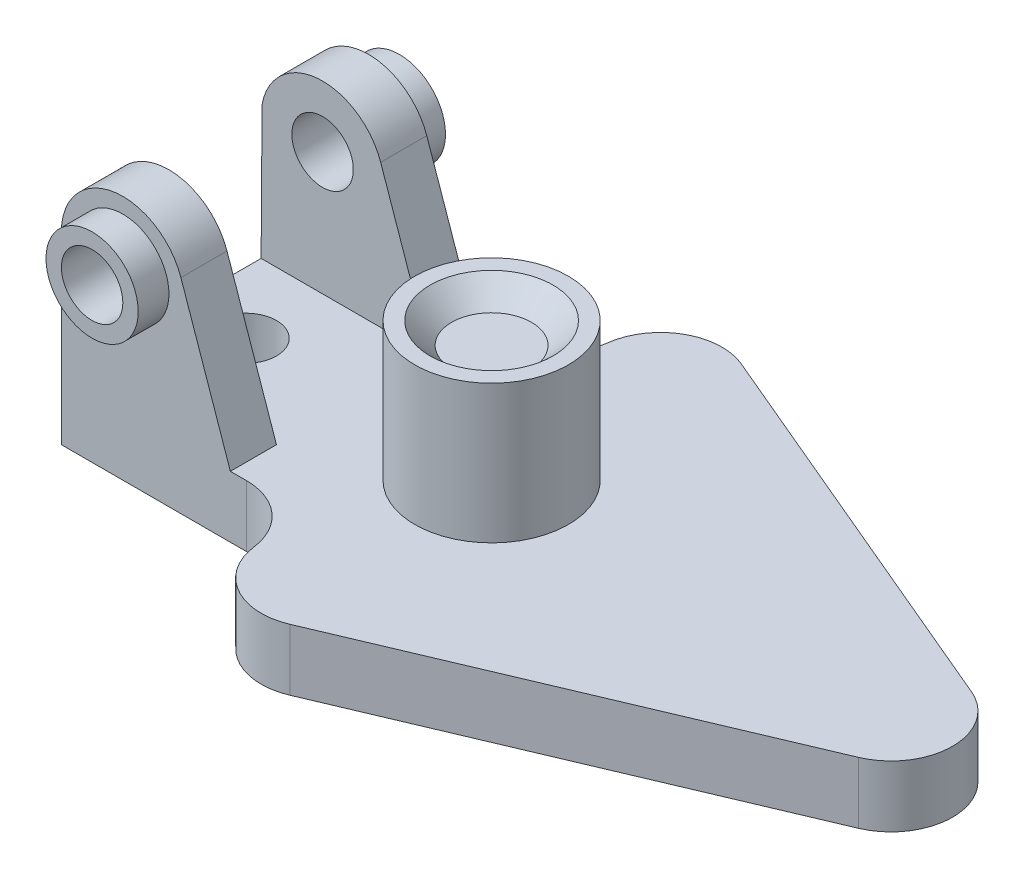
ISO-10303-21;
HEADER;
FILE_DESCRIPTION(('STEP AP214'),'2;1');
FILE_NAME('part.step','',(''),(''),'','','');
FILE_SCHEMA(('AUTOMOTIVE_DESIGN { 1 0 10303 214 1 1 1 1 }'));
ENDSEC;
DATA;
#1=APPLICATION_CONTEXT('core data for automotive mechanical design processes');
#2=APPLICATION_PROTOCOL_DEFINITION('international standard','automotive_design',2000,#1);
#3=PRODUCT_CONTEXT('',#1,'mechanical');
#4=PRODUCT('Part','Part','',(#3));
#5=PRODUCT_RELATED_PRODUCT_CATEGORY('part','',(#4));
#6=PRODUCT_DEFINITION_FORMATION('','',#4);
#7=PRODUCT_DEFINITION_CONTEXT('part definition',#1,'design');
#8=PRODUCT_DEFINITION('design','',#6,#7);
#9=PRODUCT_DEFINITION_SHAPE('','',#8);
#10=(LENGTH_UNIT() NAMED_UNIT(*) SI_UNIT(.MILLI.,.METRE.));
#11=(NAMED_UNIT(*) PLANE_ANGLE_UNIT() SI_UNIT($,.RADIAN.));
#12=(NAMED_UNIT(*) SI_UNIT($,.STERADIAN.) SOLID_ANGLE_UNIT());
#13=UNCERTAINTY_MEASURE_WITH_UNIT(LENGTH_MEASURE(1.E-05),#10,'distance_accuracy_value','');
#14=(GEOMETRIC_REPRESENTATION_CONTEXT(3) GLOBAL_UNCERTAINTY_ASSIGNED_CONTEXT((#13)) GLOBAL_UNIT_ASSIGNED_CONTEXT((#10,
#11,#12)) REPRESENTATION_CONTEXT('',''));
#15=CARTESIAN_POINT('',(0.,0.,0.));
#16=DIRECTION('',(0.,0.,1.));
#17=DIRECTION('',(1.,0.,0.));
#18=AXIS2_PLACEMENT_3D('',#15,#16,#17);
#19=CARTESIAN_POINT('',(-77.2801181104764,20.,56.6735980217483));
#20=DIRECTION('',(0.,0.,-1.));
#21=DIRECTION('',(-1.,0.,0.));
#22=AXIS2_PLACEMENT_3D('',#19,#20,#21);
#23=PLANE('',#22);
#24=DIRECTION('',(1.,0.,0.));
#25=VECTOR('',#24,1.);
#26=CARTESIAN_POINT('',(-77.2801181104764,0.,56.6735980217483));
#27=LINE('',#26,#25);
#28=CARTESIAN_POINT('',(-77.2801181104764,0.,56.6735980217483));
#29=VERTEX_POINT('',#28);
#30=CARTESIAN_POINT('',(-16.9663877764453,0.,56.6735980217482));
#31=VERTEX_POINT('',#30);
#32=EDGE_CURVE('E314',#29,#31,#27,.T.);
#33=ORIENTED_EDGE('',*,*,#32,.T.);
#34=DIRECTION('',(0.,-1.,0.));
#35=VECTOR('',#34,1.);
#36=CARTESIAN_POINT('',(-16.9663877764453,20.,56.6735980217482));
#37=LINE('',#36,#35);
#38=CARTESIAN_POINT('',(-16.9663877764453,20.,56.6735980217482));
#39=VERTEX_POINT('',#38);
#40=EDGE_CURVE('E364',#39,#31,#37,.T.);
#41=ORIENTED_EDGE('',*,*,#40,.F.);
#42=DIRECTION('',(1.,0.,0.));
#43=VECTOR('',#42,1.);
#44=CARTESIAN_POINT('',(-77.2801181104764,20.,56.6735980217483));
#45=LINE('',#44,#43);
#46=CARTESIAN_POINT('',(-22.2801181104764,20.,56.6735980217482));
#47=VERTEX_POINT('',#46);
#48=EDGE_CURVE('E196',#47,#39,#45,.T.);
#49=ORIENTED_EDGE('',*,*,#48,.F.);
#50=DIRECTION('',(-0.326920394801529,0.945051879773175,0.));
#51=VECTOR('',#50,1.);
#52=CARTESIAN_POINT('',(-38.3790805150129,66.5384078960306,56.6735980217482));
#53=LINE('',#52,#51);
#54=CARTESIAN_POINT('',(-38.3790805150129,66.5384078960306,56.6735980217482));
#55=VERTEX_POINT('',#54);
#56=EDGE_CURVE('E240',#47,#55,#53,.T.);
#57=ORIENTED_EDGE('',*,*,#56,.T.);
#58=CARTESIAN_POINT('',(-57.2801181104764,60.,56.6735980217482));
#59=DIRECTION('',(0.,0.,1.));
#60=DIRECTION('',(-1.,0.,0.));
#61=AXIS2_PLACEMENT_3D('',#58,#59,#60);
#62=CIRCLE('',#61,20.);
#63=CARTESIAN_POINT('',(-77.2801181104764,60.,56.6735980217482));
#64=VERTEX_POINT('',#63);
#65=EDGE_CURVE('E245',#55,#64,#62,.T.);
#66=ORIENTED_EDGE('',*,*,#65,.T.);
#67=DIRECTION('',(0.,-1.,0.));
#68=VECTOR('',#67,1.);
#69=CARTESIAN_POINT('',(-77.2801181104764,20.,56.6735980217483));
#70=LINE('',#69,#68);
#71=EDGE_CURVE('E368',#64,#29,#70,.T.);
#72=ORIENTED_EDGE('',*,*,#71,.T.);
#73=EDGE_LOOP('',(#33,#41,#49,#57,#66,#72));
#74=FACE_BOUND('',#73,.T.);
#75=CARTESIAN_POINT('',(-57.2801181104764,60.,56.6735980217483));
#76=DIRECTION('',(0.,0.,-1.));
#77=DIRECTION('',(-1.,0.,0.));
#78=AXIS2_PLACEMENT_3D('',#75,#76,#77);
#79=CIRCLE('',#78,15.);
#80=CARTESIAN_POINT('',(-72.2801181104764,60.,56.6735980217483));
#81=VERTEX_POINT('',#80);
#82=EDGE_CURVE('E60',#81,#81,#79,.F.);
#83=ORIENTED_EDGE('',*,*,#82,.F.);
#84=EDGE_LOOP('',(#83));
#85=FACE_BOUND('',#84,.T.);
#86=ADVANCED_FACE('F51',(#74,#85),#23,.F.);
#87=CARTESIAN_POINT('',(-16.9663877764453,20.,-43.3264019782518));
#88=DIRECTION('',(0.,1.,0.));
#89=DIRECTION('',(0.,0.,1.));
#90=AXIS2_PLACEMENT_3D('',#87,#88,#89);
#91=PLANE('',#90);
#92=CARTESIAN_POINT('',(22.7198818895236,20.,16.6735980217483));
#93=DIRECTION('',(0.,1.,0.));
#94=DIRECTION('',(0.,0.,1.));
#95=AXIS2_PLACEMENT_3D('',#92,#93,#94);
#96=CIRCLE('',#95,25.);
#97=CARTESIAN_POINT('',(22.7198818895236,20.,-8.32640197825173));
#98=VERTEX_POINT('',#97);
#99=EDGE_CURVE('E782',#98,#98,#96,.T.);
#100=ORIENTED_EDGE('',*,*,#99,.F.);
#101=EDGE_LOOP('',(#100));
#102=FACE_BOUND('',#101,.T.);
#103=DIRECTION('',(0.,0.,-1.));
#104=VECTOR('',#103,1.);
#105=CARTESIAN_POINT('',(-22.2801181104764,20.,-8.32640197825174));
#106=LINE('',#105,#104);
#107=CARTESIAN_POINT('',(-22.2801181104764,20.,-8.32640197825175));
#108=VERTEX_POINT('',#107);
#109=CARTESIAN_POINT('',(-22.2801181104764,20.,-23.3264019782517));
#110=VERTEX_POINT('',#109);
#111=EDGE_CURVE('E67',#108,#110,#106,.T.);
#112=ORIENTED_EDGE('',*,*,#111,.F.);
#113=DIRECTION('',(-1.,0.,0.));
#114=VECTOR('',#113,1.);
#115=CARTESIAN_POINT('',(-77.2801181104764,20.,-8.32640197825175));
#116=LINE('',#115,#114);
#117=CARTESIAN_POINT('',(-77.2801181104764,20.,-8.32640197825175));
#118=VERTEX_POINT('',#117);
#119=EDGE_CURVE('E178',#108,#118,#116,.T.);
#120=ORIENTED_EDGE('',*,*,#119,.T.);
#121=DIRECTION('',(0.,0.,1.));
#122=VECTOR('',#121,1.);
#123=CARTESIAN_POINT('',(-77.2801181104764,20.,56.6735980217483));
#124=LINE('',#123,#122);
#125=CARTESIAN_POINT('',(-77.2801181104764,20.,41.6735980217482));
#126=VERTEX_POINT('',#125);
#127=EDGE_CURVE('E166',#118,#126,#124,.T.);
#128=ORIENTED_EDGE('',*,*,#127,.T.);
#129=DIRECTION('',(1.,0.,0.));
#130=VECTOR('',#129,1.);
#131=CARTESIAN_POINT('',(-77.2801181104764,20.,41.6735980217482));
#132=LINE('',#131,#130);
#133=CARTESIAN_POINT('',(-22.2801181104764,20.,41.6735980217482));
#134=VERTEX_POINT('',#133);
#135=EDGE_CURVE('E241',#126,#134,#132,.T.);
#136=ORIENTED_EDGE('',*,*,#135,.T.);
#137=DIRECTION('',(0.,0.,1.));
#138=VECTOR('',#137,1.);
#139=CARTESIAN_POINT('',(-22.2801181104764,20.,41.6735980217482));
#140=LINE('',#139,#138);
#141=EDGE_CURVE('E255',#134,#47,#140,.T.);
#142=ORIENTED_EDGE('',*,*,#141,.T.);
#143=ORIENTED_EDGE('',*,*,#48,.T.);
#144=CARTESIAN_POINT('',(-16.9663877764453,20.,76.6735980217483));
#145=DIRECTION('',(0.,-1.,0.));
#146=DIRECTION('',(0.,0.,-1.));
#147=AXIS2_PLACEMENT_3D('',#144,#145,#146);
#148=CIRCLE('',#147,20.);
#149=CARTESIAN_POINT('',(2.87674705653915,20.,74.1735980217483));
#150=VERTEX_POINT('',#149);
#151=EDGE_CURVE('E286',#39,#150,#148,.T.);
#152=ORIENTED_EDGE('',*,*,#151,.T.);
#153=CARTESIAN_POINT('',(22.7198818895236,20.,71.6735980217482));
#154=DIRECTION('',(0.,1.,0.));
#155=DIRECTION('',(0.,0.,1.));
#156=AXIS2_PLACEMENT_3D('',#153,#154,#155);
#157=CIRCLE('',#156,20.);
#158=CARTESIAN_POINT('',(30.5126817062575,20.,90.0929430431194));
#159=VERTEX_POINT('',#158);
#160=EDGE_CURVE('E289',#150,#159,#157,.T.);
#161=ORIENTED_EDGE('',*,*,#160,.T.);
#162=DIRECTION('',(0.920967251068559,0.,-0.389639990836698));
#163=VECTOR('',#162,1.);
#164=CARTESIAN_POINT('',(30.5126817062575,20.,90.0929430431194));
#165=LINE('',#164,#163);
#166=CARTESIAN_POINT('',(160.512681706258,20.,35.0929430431194));
#167=VERTEX_POINT('',#166);
#168=EDGE_CURVE('E292',#159,#167,#165,.T.);
#169=ORIENTED_EDGE('',*,*,#168,.T.);
#170=CARTESIAN_POINT('',(152.719881889524,20.,16.6735980217483));
#171=DIRECTION('',(0.,1.,0.));
#172=DIRECTION('',(0.,0.,1.));
#173=AXIS2_PLACEMENT_3D('',#170,#171,#172);
#174=CIRCLE('',#173,20.);
#175=CARTESIAN_POINT('',(160.512681706258,20.,-1.74574699962293));
#176=VERTEX_POINT('',#175);
#177=EDGE_CURVE('E295',#167,#176,#174,.T.);
#178=ORIENTED_EDGE('',*,*,#177,.T.);
#179=DIRECTION('',(-0.920967251068559,0.,-0.389639990836698));
#180=VECTOR('',#179,1.);
#181=CARTESIAN_POINT('',(30.5126817062575,20.,-56.7457469996229));
#182=LINE('',#181,#180);
#183=CARTESIAN_POINT('',(30.5126817062575,20.,-56.7457469996229));
#184=VERTEX_POINT('',#183);
#185=EDGE_CURVE('E298',#176,#184,#182,.T.);
#186=ORIENTED_EDGE('',*,*,#185,.T.);
#187=CARTESIAN_POINT('',(22.7198818895236,20.,-38.3264019782517));
#188=DIRECTION('',(0.,1.,0.));
#189=DIRECTION('',(0.,0.,-1.));
#190=AXIS2_PLACEMENT_3D('',#187,#188,#189);
#191=CIRCLE('',#190,20.);
#192=CARTESIAN_POINT('',(2.87674705653914,20.,-40.8264019782518));
#193=VERTEX_POINT('',#192);
#194=EDGE_CURVE('E301',#184,#193,#191,.T.);
#195=ORIENTED_EDGE('',*,*,#194,.T.);
#196=CARTESIAN_POINT('',(-16.9663877764453,20.,-43.3264019782518));
#197=DIRECTION('',(0.,-1.,0.));
#198=DIRECTION('',(0.,0.,1.));
#199=AXIS2_PLACEMENT_3D('',#196,#197,#198);
#200=CIRCLE('',#199,20.);
#201=CARTESIAN_POINT('',(-16.9663877764453,20.,-23.3264019782518));
#202=VERTEX_POINT('',#201);
#203=EDGE_CURVE('E304',#193,#202,#200,.T.);
#204=ORIENTED_EDGE('',*,*,#203,.T.);
#205=DIRECTION('',(-1.,0.,0.));
#206=VECTOR('',#205,1.);
#207=CARTESIAN_POINT('',(-77.2801181104764,20.,-23.3264019782517));
#208=LINE('',#207,#206);
#209=EDGE_CURVE('E72',#202,#110,#208,.T.);
#210=ORIENTED_EDGE('',*,*,#209,.T.);
#211=EDGE_LOOP('',(#112,#120,#128,#136,#142,#143,#152,#161,#169,#178,#186,#195,#204,#210));
#212=FACE_BOUND('',#211,.T.);
#213=CARTESIAN_POINT('',(-57.2801181104764,20.,16.6735980217483));
#214=DIRECTION('',(0.,1.,0.));
#215=DIRECTION('',(0.,0.,1.));
#216=AXIS2_PLACEMENT_3D('',#213,#214,#215);
#217=CIRCLE('',#216,10.);
#218=CARTESIAN_POINT('',(-57.2801181104764,20.,26.6735980217483));
#219=VERTEX_POINT('',#218);
#220=EDGE_CURVE('E273',#219,#219,#217,.T.);
#221=ORIENTED_EDGE('',*,*,#220,.F.);
#222=EDGE_LOOP('',(#221));
#223=FACE_BOUND('',#222,.T.);
#224=ADVANCED_FACE('F179',(#102,#212,#223),#91,.T.);
#225=CARTESIAN_POINT('',(-16.9663877764453,0.,-43.3264019782518));
#226=DIRECTION('',(0.,1.,0.));
#227=DIRECTION('',(0.,0.,1.));
#228=AXIS2_PLACEMENT_3D('',#225,#226,#227);
#229=PLANE('',#228);
#230=DIRECTION('',(-1.,0.,0.));
#231=VECTOR('',#230,1.);
#232=CARTESIAN_POINT('',(-77.2801181104764,0.,-23.3264019782517));
#233=LINE('',#232,#231);
#234=CARTESIAN_POINT('',(-16.9663877764453,0.,-23.3264019782518));
#235=VERTEX_POINT('',#234);
#236=CARTESIAN_POINT('',(-77.2801181104764,0.,-23.3264019782517));
#237=VERTEX_POINT('',#236);
#238=EDGE_CURVE('E277',#235,#237,#233,.T.);
#239=ORIENTED_EDGE('',*,*,#238,.F.);
#240=CARTESIAN_POINT('',(-16.9663877764453,0.,-43.3264019782518));
#241=DIRECTION('',(0.,-1.,0.));
#242=DIRECTION('',(0.,0.,1.));
#243=AXIS2_PLACEMENT_3D('',#240,#241,#242);
#244=CIRCLE('',#243,20.);
#245=CARTESIAN_POINT('',(2.87674705653914,0.,-40.8264019782518));
#246=VERTEX_POINT('',#245);
#247=EDGE_CURVE('E282',#246,#235,#244,.T.);
#248=ORIENTED_EDGE('',*,*,#247,.F.);
#249=CARTESIAN_POINT('',(22.7198818895236,0.,-38.3264019782517));
#250=DIRECTION('',(0.,1.,0.));
#251=DIRECTION('',(0.,0.,-1.));
#252=AXIS2_PLACEMENT_3D('',#249,#250,#251);
#253=CIRCLE('',#252,20.);
#254=CARTESIAN_POINT('',(30.5126817062575,0.,-56.7457469996229));
#255=VERTEX_POINT('',#254);
#256=EDGE_CURVE('E332',#255,#246,#253,.T.);
#257=ORIENTED_EDGE('',*,*,#256,.F.);
#258=DIRECTION('',(-0.920967251068559,0.,-0.389639990836698));
#259=VECTOR('',#258,1.);
#260=CARTESIAN_POINT('',(30.5126817062575,0.,-56.7457469996229));
#261=LINE('',#260,#259);
#262=CARTESIAN_POINT('',(160.512681706258,0.,-1.74574699962293));
#263=VERTEX_POINT('',#262);
#264=EDGE_CURVE('E329',#263,#255,#261,.T.);
#265=ORIENTED_EDGE('',*,*,#264,.F.);
#266=CARTESIAN_POINT('',(152.719881889524,0.,16.6735980217483));
#267=DIRECTION('',(0.,1.,0.));
#268=DIRECTION('',(0.,0.,1.));
#269=AXIS2_PLACEMENT_3D('',#266,#267,#268);
#270=CIRCLE('',#269,20.);
#271=CARTESIAN_POINT('',(160.512681706258,0.,35.0929430431194));
#272=VERTEX_POINT('',#271);
#273=EDGE_CURVE('E326',#272,#263,#270,.T.);
#274=ORIENTED_EDGE('',*,*,#273,.F.);
#275=DIRECTION('',(0.920967251068559,0.,-0.389639990836698));
#276=VECTOR('',#275,1.);
#277=CARTESIAN_POINT('',(30.5126817062575,0.,90.0929430431194));
#278=LINE('',#277,#276);
#279=CARTESIAN_POINT('',(30.5126817062575,0.,90.0929430431194));
#280=VERTEX_POINT('',#279);
#281=EDGE_CURVE('E323',#280,#272,#278,.T.);
#282=ORIENTED_EDGE('',*,*,#281,.F.);
#283=CARTESIAN_POINT('',(22.7198818895236,0.,71.6735980217482));
#284=DIRECTION('',(0.,1.,0.));
#285=DIRECTION('',(0.,0.,1.));
#286=AXIS2_PLACEMENT_3D('',#283,#284,#285);
#287=CIRCLE('',#286,20.);
#288=CARTESIAN_POINT('',(2.87674705653915,0.,74.1735980217483));
#289=VERTEX_POINT('',#288);
#290=EDGE_CURVE('E320',#289,#280,#287,.T.);
#291=ORIENTED_EDGE('',*,*,#290,.F.);
#292=CARTESIAN_POINT('',(-16.9663877764453,0.,76.6735980217483));
#293=DIRECTION('',(0.,-1.,0.));
#294=DIRECTION('',(0.,0.,-1.));
#295=AXIS2_PLACEMENT_3D('',#292,#293,#294);
#296=CIRCLE('',#295,20.);
#297=EDGE_CURVE('E317',#31,#289,#296,.T.);
#298=ORIENTED_EDGE('',*,*,#297,.F.);
#299=ORIENTED_EDGE('',*,*,#32,.F.);
#300=DIRECTION('',(0.,0.,1.));
#301=VECTOR('',#300,1.);
#302=CARTESIAN_POINT('',(-77.2801181104764,0.,56.6735980217483));
#303=LINE('',#302,#301);
#304=EDGE_CURVE('E311',#237,#29,#303,.T.);
#305=ORIENTED_EDGE('',*,*,#304,.F.);
#306=EDGE_LOOP('',(#239,#248,#257,#265,#274,#282,#291,#298,#299,#305));
#307=FACE_BOUND('',#306,.T.);
#308=CARTESIAN_POINT('',(-57.2801181104764,0.,16.6735980217483));
#309=DIRECTION('',(0.,1.,0.));
#310=DIRECTION('',(0.,0.,1.));
#311=AXIS2_PLACEMENT_3D('',#308,#309,#310);
#312=CIRCLE('',#311,10.);
#313=CARTESIAN_POINT('',(-57.2801181104764,0.,26.6735980217483));
#314=VERTEX_POINT('',#313);
#315=EDGE_CURVE('E266',#314,#314,#312,.T.);
#316=ORIENTED_EDGE('',*,*,#315,.T.);
#317=EDGE_LOOP('',(#316));
#318=FACE_BOUND('',#317,.T.);
#319=ADVANCED_FACE('F386',(#307,#318),#229,.F.);
#320=CARTESIAN_POINT('',(-77.2801181104764,20.,-23.3264019782517));
#321=DIRECTION('',(0.,0.,1.));
#322=DIRECTION('',(1.,0.,0.));
#323=AXIS2_PLACEMENT_3D('',#320,#321,#322);
#324=PLANE('',#323);
#325=CARTESIAN_POINT('',(-57.2801181104764,60.,-23.3264019782517));
#326=DIRECTION('',(0.,0.,1.));
#327=DIRECTION('',(1.,0.,0.));
#328=AXIS2_PLACEMENT_3D('',#325,#326,#327);
#329=CIRCLE('',#328,15.);
#330=CARTESIAN_POINT('',(-42.2801181104764,60.,-23.3264019782517));
#331=VERTEX_POINT('',#330);
#332=EDGE_CURVE('E12',#331,#331,#329,.F.);
#333=ORIENTED_EDGE('',*,*,#332,.F.);
#334=EDGE_LOOP('',(#333));
#335=FACE_BOUND('',#334,.T.);
#336=ORIENTED_EDGE('',*,*,#238,.T.);
#337=DIRECTION('',(0.,-1.,0.));
#338=VECTOR('',#337,1.);
#339=CARTESIAN_POINT('',(-77.2801181104764,20.,-23.3264019782517));
#340=LINE('',#339,#338);
#341=CARTESIAN_POINT('',(-77.2801181104764,20.,-23.3264019782517));
#342=VERTEX_POINT('',#341);
#343=EDGE_CURVE('E372',#342,#237,#340,.T.);
#344=ORIENTED_EDGE('',*,*,#343,.F.);
#345=DIRECTION('',(0.0071500071873193,0.999974438371912,0.));
#346=VECTOR('',#345,1.);
#347=CARTESIAN_POINT('',(-76.9689843899648,63.5140496052881,-23.3264019782517));
#348=LINE('',#347,#346);
#349=CARTESIAN_POINT('',(-76.9689843899648,63.5140496052881,-23.3264019782517));
#350=VERTEX_POINT('',#349);
#351=EDGE_CURVE('E194',#342,#350,#348,.T.);
#352=ORIENTED_EDGE('',*,*,#351,.T.);
#353=CARTESIAN_POINT('',(-57.2801181104764,60.,-23.3264019782517));
#354=DIRECTION('',(0.,0.,-1.));
#355=DIRECTION('',(1.,0.,0.));
#356=AXIS2_PLACEMENT_3D('',#353,#354,#355);
#357=CIRCLE('',#356,20.);
#358=CARTESIAN_POINT('',(-38.3790805150129,66.5384078960306,-23.3264019782517));
#359=VERTEX_POINT('',#358);
#360=EDGE_CURVE('E213',#350,#359,#357,.T.);
#361=ORIENTED_EDGE('',*,*,#360,.T.);
#362=DIRECTION('',(0.326920394801529,-0.945051879773175,0.));
#363=VECTOR('',#362,1.);
#364=CARTESIAN_POINT('',(-22.2801181104764,20.,-23.3264019782517));
#365=LINE('',#364,#363);
#366=EDGE_CURVE('E187',#359,#110,#365,.T.);
#367=ORIENTED_EDGE('',*,*,#366,.T.);
#368=ORIENTED_EDGE('',*,*,#209,.F.);
#369=DIRECTION('',(0.,-1.,0.));
#370=VECTOR('',#369,1.);
#371=CARTESIAN_POINT('',(-16.9663877764453,20.,-23.3264019782518));
#372=LINE('',#371,#370);
#373=EDGE_CURVE('E307',#202,#235,#372,.T.);
#374=ORIENTED_EDGE('',*,*,#373,.T.);
#375=EDGE_LOOP('',(#336,#344,#352,#361,#367,#368,#374));
#376=FACE_BOUND('',#375,.T.);
#377=ADVANCED_FACE('F53',(#335,#376),#324,.F.);
#378=CARTESIAN_POINT('',(-77.2801181104764,20.,56.6735980217483));
#379=DIRECTION('',(1.,0.,0.));
#380=DIRECTION('',(0.,0.,-1.));
#381=AXIS2_PLACEMENT_3D('',#378,#379,#380);
#382=PLANE('',#381);
#383=ORIENTED_EDGE('',*,*,#304,.T.);
#384=ORIENTED_EDGE('',*,*,#71,.F.);
#385=DIRECTION('',(0.,0.,1.));
#386=VECTOR('',#385,1.);
#387=CARTESIAN_POINT('',(-77.2801181104764,60.,41.6735980217482));
#388=LINE('',#387,#386);
#389=CARTESIAN_POINT('',(-77.2801181104764,60.,41.6735980217482));
#390=VERTEX_POINT('',#389);
#391=EDGE_CURVE('E262',#390,#64,#388,.T.);
#392=ORIENTED_EDGE('',*,*,#391,.F.);
#393=DIRECTION('',(0.,-1.,0.));
#394=VECTOR('',#393,1.);
#395=CARTESIAN_POINT('',(-77.2801181104764,20.,41.6735980217482));
#396=LINE('',#395,#394);
#397=EDGE_CURVE('E173',#390,#126,#396,.T.);
#398=ORIENTED_EDGE('',*,*,#397,.T.);
#399=ORIENTED_EDGE('',*,*,#127,.F.);
#400=EDGE_CURVE('E170',#342,#118,#124,.T.);
#401=ORIENTED_EDGE('',*,*,#400,.F.);
#402=ORIENTED_EDGE('',*,*,#343,.T.);
#403=EDGE_LOOP('',(#383,#384,#392,#398,#399,#401,#402));
#404=FACE_BOUND('',#403,.T.);
#405=ADVANCED_FACE('F167',(#404),#382,.F.);
#406=CARTESIAN_POINT('',(-16.9663877764453,20.,76.6735980217483));
#407=DIRECTION('',(0.,-1.,0.));
#408=DIRECTION('',(0.,0.,-1.));
#409=AXIS2_PLACEMENT_3D('',#406,#407,#408);
#410=CYLINDRICAL_SURFACE('',#409,20.);
#411=ORIENTED_EDGE('',*,*,#297,.T.);
#412=DIRECTION('',(0.,-1.,0.));
#413=VECTOR('',#412,1.);
#414=CARTESIAN_POINT('',(2.87674705653915,20.,74.1735980217483));
#415=LINE('',#414,#413);
#416=EDGE_CURVE('E360',#150,#289,#415,.T.);
#417=ORIENTED_EDGE('',*,*,#416,.F.);
#418=ORIENTED_EDGE('',*,*,#151,.F.);
#419=ORIENTED_EDGE('',*,*,#40,.T.);
#420=EDGE_LOOP('',(#411,#417,#418,#419));
#421=FACE_BOUND('',#420,.T.);
#422=ADVANCED_FACE('F390',(#421),#410,.F.);
#423=CARTESIAN_POINT('',(22.7198818895236,20.,71.6735980217482));
#424=DIRECTION('',(0.,-1.,0.));
#425=DIRECTION('',(0.,0.,-1.));
#426=AXIS2_PLACEMENT_3D('',#423,#424,#425);
#427=CYLINDRICAL_SURFACE('',#426,20.);
#428=ORIENTED_EDGE('',*,*,#290,.T.);
#429=DIRECTION('',(0.,-1.,0.));
#430=VECTOR('',#429,1.);
#431=CARTESIAN_POINT('',(30.5126817062575,20.,90.0929430431194));
#432=LINE('',#431,#430);
#433=EDGE_CURVE('E356',#159,#280,#432,.T.);
#434=ORIENTED_EDGE('',*,*,#433,.F.);
#435=ORIENTED_EDGE('',*,*,#160,.F.);
#436=ORIENTED_EDGE('',*,*,#416,.T.);
#437=EDGE_LOOP('',(#428,#434,#435,#436));
#438=FACE_BOUND('',#437,.T.);
#439=ADVANCED_FACE('F397',(#438),#427,.T.);
#440=CARTESIAN_POINT('',(30.5126817062575,20.,90.0929430431194));
#441=DIRECTION('',(-0.389639990836698,0.,-0.920967251068559));
#442=DIRECTION('',(-0.920967251068559,0.,0.389639990836698));
#443=AXIS2_PLACEMENT_3D('',#440,#441,#442);
#444=PLANE('',#443);
#445=ORIENTED_EDGE('',*,*,#281,.T.);
#446=DIRECTION('',(0.,-1.,0.));
#447=VECTOR('',#446,1.);
#448=CARTESIAN_POINT('',(160.512681706258,20.,35.0929430431194));
#449=LINE('',#448,#447);
#450=EDGE_CURVE('E352',#167,#272,#449,.T.);
#451=ORIENTED_EDGE('',*,*,#450,.F.);
#452=ORIENTED_EDGE('',*,*,#168,.F.);
#453=ORIENTED_EDGE('',*,*,#433,.T.);
#454=EDGE_LOOP('',(#445,#451,#452,#453));
#455=FACE_BOUND('',#454,.T.);
#456=ADVANCED_FACE('F434',(#455),#444,.F.);
#457=CARTESIAN_POINT('',(152.719881889524,20.,16.6735980217483));
#458=DIRECTION('',(0.,-1.,0.));
#459=DIRECTION('',(0.,0.,-1.));
#460=AXIS2_PLACEMENT_3D('',#457,#458,#459);
#461=CYLINDRICAL_SURFACE('',#460,20.);
#462=ORIENTED_EDGE('',*,*,#273,.T.);
#463=DIRECTION('',(0.,-1.,0.));
#464=VECTOR('',#463,1.);
#465=CARTESIAN_POINT('',(160.512681706258,20.,-1.74574699962293));
#466=LINE('',#465,#464);
#467=EDGE_CURVE('E348',#176,#263,#466,.T.);
#468=ORIENTED_EDGE('',*,*,#467,.F.);
#469=ORIENTED_EDGE('',*,*,#177,.F.);
#470=ORIENTED_EDGE('',*,*,#450,.T.);
#471=EDGE_LOOP('',(#462,#468,#469,#470));
#472=FACE_BOUND('',#471,.T.);
#473=ADVANCED_FACE('F439',(#472),#461,.T.);
#474=CARTESIAN_POINT('',(30.5126817062575,20.,-56.7457469996229));
#475=DIRECTION('',(-0.389639990836698,0.,0.920967251068559));
#476=DIRECTION('',(0.920967251068559,0.,0.389639990836698));
#477=AXIS2_PLACEMENT_3D('',#474,#475,#476);
#478=PLANE('',#477);
#479=ORIENTED_EDGE('',*,*,#264,.T.);
#480=DIRECTION('',(0.,-1.,0.));
#481=VECTOR('',#480,1.);
#482=CARTESIAN_POINT('',(30.5126817062575,20.,-56.7457469996229));
#483=LINE('',#482,#481);
#484=EDGE_CURVE('E344',#184,#255,#483,.T.);
#485=ORIENTED_EDGE('',*,*,#484,.F.);
#486=ORIENTED_EDGE('',*,*,#185,.F.);
#487=ORIENTED_EDGE('',*,*,#467,.T.);
#488=EDGE_LOOP('',(#479,#485,#486,#487));
#489=FACE_BOUND('',#488,.T.);
#490=ADVANCED_FACE('F445',(#489),#478,.F.);
#491=CARTESIAN_POINT('',(22.7198818895236,20.,-38.3264019782517));
#492=DIRECTION('',(0.,-1.,0.));
#493=DIRECTION('',(0.,0.,-1.));
#494=AXIS2_PLACEMENT_3D('',#491,#492,#493);
#495=CYLINDRICAL_SURFACE('',#494,20.);
#496=ORIENTED_EDGE('',*,*,#256,.T.);
#497=DIRECTION('',(0.,-1.,0.));
#498=VECTOR('',#497,1.);
#499=CARTESIAN_POINT('',(2.87674705653914,20.,-40.8264019782518));
#500=LINE('',#499,#498);
#501=EDGE_CURVE('E340',#193,#246,#500,.T.);
#502=ORIENTED_EDGE('',*,*,#501,.F.);
#503=ORIENTED_EDGE('',*,*,#194,.F.);
#504=ORIENTED_EDGE('',*,*,#484,.T.);
#505=EDGE_LOOP('',(#496,#502,#503,#504));
#506=FACE_BOUND('',#505,.T.);
#507=ADVANCED_FACE('F448',(#506),#495,.T.);
#508=CARTESIAN_POINT('',(-16.9663877764453,20.,-43.3264019782518));
#509=DIRECTION('',(0.,-1.,0.));
#510=DIRECTION('',(0.,0.,-1.));
#511=AXIS2_PLACEMENT_3D('',#508,#509,#510);
#512=CYLINDRICAL_SURFACE('',#511,20.);
#513=ORIENTED_EDGE('',*,*,#247,.T.);
#514=ORIENTED_EDGE('',*,*,#373,.F.);
#515=ORIENTED_EDGE('',*,*,#203,.F.);
#516=ORIENTED_EDGE('',*,*,#501,.T.);
#517=EDGE_LOOP('',(#513,#514,#515,#516));
#518=FACE_BOUND('',#517,.T.);
#519=ADVANCED_FACE('F451',(#518),#512,.F.);
#520=CARTESIAN_POINT('',(-57.2801181104764,20.,16.6735980217483));
#521=DIRECTION('',(0.,-1.,0.));
#522=DIRECTION('',(0.,0.,-1.));
#523=AXIS2_PLACEMENT_3D('',#520,#521,#522);
#524=CYLINDRICAL_SURFACE('',#523,10.);
#525=ORIENTED_EDGE('',*,*,#220,.T.);
#526=EDGE_LOOP('',(#525));
#527=FACE_BOUND('',#526,.T.);
#528=ORIENTED_EDGE('',*,*,#315,.F.);
#529=EDGE_LOOP('',(#528));
#530=FACE_BOUND('',#529,.T.);
#531=ADVANCED_FACE('F485',(#527,#530),#524,.F.);
#532=CARTESIAN_POINT('',(-57.2801181104764,60.,41.6735980217482));
#533=DIRECTION('',(0.,0.,1.));
#534=DIRECTION('',(1.,0.,0.));
#535=AXIS2_PLACEMENT_3D('',#532,#533,#534);
#536=CYLINDRICAL_SURFACE('',#535,20.);
#537=ORIENTED_EDGE('',*,*,#65,.F.);
#538=DIRECTION('',(0.,0.,1.));
#539=VECTOR('',#538,1.);
#540=CARTESIAN_POINT('',(-38.3790805150129,66.5384078960306,41.6735980217482));
#541=LINE('',#540,#539);
#542=CARTESIAN_POINT('',(-38.3790805150129,66.5384078960306,41.6735980217482));
#543=VERTEX_POINT('',#542);
#544=EDGE_CURVE('E267',#543,#55,#541,.T.);
#545=ORIENTED_EDGE('',*,*,#544,.F.);
#546=CARTESIAN_POINT('',(-57.2801181104764,60.,41.6735980217482));
#547=DIRECTION('',(0.,0.,1.));
#548=DIRECTION('',(-1.,0.,0.));
#549=AXIS2_PLACEMENT_3D('',#546,#547,#548);
#550=CIRCLE('',#549,20.);
#551=EDGE_CURVE('E249',#543,#390,#550,.T.);
#552=ORIENTED_EDGE('',*,*,#551,.T.);
#553=ORIENTED_EDGE('',*,*,#391,.T.);
#554=EDGE_LOOP('',(#537,#545,#552,#553));
#555=FACE_BOUND('',#554,.T.);
#556=ADVANCED_FACE('F418',(#555),#536,.T.);
#557=CARTESIAN_POINT('',(-38.3790805150129,66.5384078960306,41.6735980217482));
#558=DIRECTION('',(0.945051879773175,0.326920394801529,0.));
#559=DIRECTION('',(-0.326920394801529,0.945051879773176,0.));
#560=AXIS2_PLACEMENT_3D('',#557,#558,#559);
#561=PLANE('',#560);
#562=ORIENTED_EDGE('',*,*,#56,.F.);
#563=ORIENTED_EDGE('',*,*,#141,.F.);
#564=DIRECTION('',(-0.326920394801529,0.945051879773175,0.));
#565=VECTOR('',#564,1.);
#566=CARTESIAN_POINT('',(-38.3790805150129,66.5384078960306,41.6735980217482));
#567=LINE('',#566,#565);
#568=EDGE_CURVE('E244',#134,#543,#567,.T.);
#569=ORIENTED_EDGE('',*,*,#568,.T.);
#570=ORIENTED_EDGE('',*,*,#544,.T.);
#571=EDGE_LOOP('',(#562,#563,#569,#570));
#572=FACE_BOUND('',#571,.T.);
#573=ADVANCED_FACE('F481',(#572),#561,.T.);
#574=CARTESIAN_POINT('',(-57.2801181104764,60.,41.6735980217482));
#575=DIRECTION('',(0.,0.,-1.));
#576=DIRECTION('',(-1.,0.,0.));
#577=AXIS2_PLACEMENT_3D('',#574,#575,#576);
#578=PLANE('',#577);
#579=CARTESIAN_POINT('',(-57.2801181104764,60.,41.6735980217482));
#580=DIRECTION('',(0.,0.,1.));
#581=DIRECTION('',(1.,0.,0.));
#582=AXIS2_PLACEMENT_3D('',#579,#580,#581);
#583=CIRCLE('',#582,10.);
#584=CARTESIAN_POINT('',(-47.2801181104764,60.,41.6735980217482));
#585=VERTEX_POINT('',#584);
#586=EDGE_CURVE('E236',#585,#585,#583,.T.);
#587=ORIENTED_EDGE('',*,*,#586,.T.);
#588=EDGE_LOOP('',(#587));
#589=FACE_BOUND('',#588,.T.);
#590=ORIENTED_EDGE('',*,*,#135,.F.);
#591=ORIENTED_EDGE('',*,*,#397,.F.);
#592=ORIENTED_EDGE('',*,*,#551,.F.);
#593=ORIENTED_EDGE('',*,*,#568,.F.);
#594=EDGE_LOOP('',(#590,#591,#592,#593));
#595=FACE_BOUND('',#594,.T.);
#596=ADVANCED_FACE('F422',(#589,#595),#578,.T.);
#597=CARTESIAN_POINT('',(-57.2801181104764,60.,41.6735980217482));
#598=DIRECTION('',(0.,0.,1.));
#599=DIRECTION('',(1.,0.,0.));
#600=AXIS2_PLACEMENT_3D('',#597,#598,#599);
#601=CYLINDRICAL_SURFACE('',#600,10.);
#602=ORIENTED_EDGE('',*,*,#586,.F.);
#603=EDGE_LOOP('',(#602));
#604=FACE_BOUND('',#603,.T.);
#605=CARTESIAN_POINT('',(-57.2801181104764,60.,66.6735980217482));
#606=DIRECTION('',(0.,0.,1.));
#607=DIRECTION('',(1.,0.,0.));
#608=AXIS2_PLACEMENT_3D('',#605,#606,#607);
#609=CIRCLE('',#608,10.);
#610=CARTESIAN_POINT('',(-47.2801181104764,60.,66.6735980217482));
#611=VERTEX_POINT('',#610);
#612=EDGE_CURVE('E223',#611,#611,#609,.F.);
#613=ORIENTED_EDGE('',*,*,#612,.F.);
#614=EDGE_LOOP('',(#613));
#615=FACE_BOUND('',#614,.T.);
#616=ADVANCED_FACE('F474',(#604,#615),#601,.F.);
#617=CARTESIAN_POINT('',(-57.2801181104764,60.,66.6735980217482));
#618=DIRECTION('',(0.,0.,-1.));
#619=DIRECTION('',(-1.,0.,0.));
#620=AXIS2_PLACEMENT_3D('',#617,#618,#619);
#621=CYLINDRICAL_SURFACE('',#620,15.);
#622=CARTESIAN_POINT('',(-57.2801181104764,60.,66.6735980217482));
#623=DIRECTION('',(0.,0.,1.));
#624=DIRECTION('',(1.,0.,0.));
#625=AXIS2_PLACEMENT_3D('',#622,#623,#624);
#626=CIRCLE('',#625,15.);
#627=CARTESIAN_POINT('',(-42.2801181104764,60.,66.6735980217482));
#628=VERTEX_POINT('',#627);
#629=EDGE_CURVE('E232',#628,#628,#626,.T.);
#630=ORIENTED_EDGE('',*,*,#629,.F.);
#631=EDGE_LOOP('',(#630));
#632=FACE_BOUND('',#631,.T.);
#633=ORIENTED_EDGE('',*,*,#82,.T.);
#634=EDGE_LOOP('',(#633));
#635=FACE_BOUND('',#634,.T.);
#636=ADVANCED_FACE('F378',(#632,#635),#621,.T.);
#637=CARTESIAN_POINT('',(-57.2801181104764,60.,66.6735980217482));
#638=DIRECTION('',(0.,0.,1.));
#639=DIRECTION('',(1.,0.,0.));
#640=AXIS2_PLACEMENT_3D('',#637,#638,#639);
#641=PLANE('',#640);
#642=ORIENTED_EDGE('',*,*,#612,.T.);
#643=EDGE_LOOP('',(#642));
#644=FACE_BOUND('',#643,.T.);
#645=ORIENTED_EDGE('',*,*,#629,.T.);
#646=EDGE_LOOP('',(#645));
#647=FACE_BOUND('',#646,.T.);
#648=ADVANCED_FACE('F465',(#644,#647),#641,.T.);
#649=CARTESIAN_POINT('',(-22.2801181104764,20.,-8.32640197825174));
#650=DIRECTION('',(0.945051879773175,0.326920394801529,0.));
#651=DIRECTION('',(-0.326920394801529,0.945051879773176,0.));
#652=AXIS2_PLACEMENT_3D('',#649,#650,#651);
#653=PLANE('',#652);
#654=ORIENTED_EDGE('',*,*,#366,.F.);
#655=DIRECTION('',(0.,0.,-1.));
#656=VECTOR('',#655,1.);
#657=CARTESIAN_POINT('',(-38.3790805150129,66.5384078960306,-8.32640197825175));
#658=LINE('',#657,#656);
#659=CARTESIAN_POINT('',(-38.3790805150129,66.5384078960306,-8.32640197825175));
#660=VERTEX_POINT('',#659);
#661=EDGE_CURVE('E224',#660,#359,#658,.T.);
#662=ORIENTED_EDGE('',*,*,#661,.F.);
#663=DIRECTION('',(0.326920394801529,-0.945051879773175,0.));
#664=VECTOR('',#663,1.);
#665=CARTESIAN_POINT('',(-22.2801181104764,20.,-8.32640197825174));
#666=LINE('',#665,#664);
#667=EDGE_CURVE('E204',#660,#108,#666,.T.);
#668=ORIENTED_EDGE('',*,*,#667,.T.);
#669=ORIENTED_EDGE('',*,*,#111,.T.);
#670=EDGE_LOOP('',(#654,#662,#668,#669));
#671=FACE_BOUND('',#670,.T.);
#672=ADVANCED_FACE('F455',(#671),#653,.T.);
#673=CARTESIAN_POINT('',(-57.2801181104764,60.,-8.32640197825175));
#674=DIRECTION('',(0.,0.,-1.));
#675=DIRECTION('',(-1.,0.,0.));
#676=AXIS2_PLACEMENT_3D('',#673,#674,#675);
#677=CYLINDRICAL_SURFACE('',#676,20.);
#678=ORIENTED_EDGE('',*,*,#360,.F.);
#679=DIRECTION('',(0.,0.,-1.));
#680=VECTOR('',#679,1.);
#681=CARTESIAN_POINT('',(-76.9689843899648,63.5140496052881,-8.32640197825175));
#682=LINE('',#681,#680);
#683=CARTESIAN_POINT('',(-76.9689843899648,63.5140496052881,-8.32640197825175));
#684=VERTEX_POINT('',#683);
#685=EDGE_CURVE('E210',#684,#350,#682,.T.);
#686=ORIENTED_EDGE('',*,*,#685,.F.);
#687=CARTESIAN_POINT('',(-57.2801181104764,60.,-8.32640197825175));
#688=DIRECTION('',(0.,0.,-1.));
#689=DIRECTION('',(1.,0.,0.));
#690=AXIS2_PLACEMENT_3D('',#687,#688,#689);
#691=CIRCLE('',#690,20.);
#692=EDGE_CURVE('E200',#684,#660,#691,.T.);
#693=ORIENTED_EDGE('',*,*,#692,.T.);
#694=ORIENTED_EDGE('',*,*,#661,.T.);
#695=EDGE_LOOP('',(#678,#686,#693,#694));
#696=FACE_BOUND('',#695,.T.);
#697=ADVANCED_FACE('F457',(#696),#677,.T.);
#698=CARTESIAN_POINT('',(-76.9689843899648,63.5140496052881,-8.32640197825175));
#699=DIRECTION('',(-0.999974438371912,0.0071500071873193,0.));
#700=DIRECTION('',(-0.0071500071873193,-0.999974438371912,0.));
#701=AXIS2_PLACEMENT_3D('',#698,#699,#700);
#702=PLANE('',#701);
#703=ORIENTED_EDGE('',*,*,#351,.F.);
#704=ORIENTED_EDGE('',*,*,#400,.T.);
#705=DIRECTION('',(0.0071500071873193,0.999974438371912,0.));
#706=VECTOR('',#705,1.);
#707=CARTESIAN_POINT('',(-76.9689843899648,63.5140496052881,-8.32640197825175));
#708=LINE('',#707,#706);
#709=EDGE_CURVE('E186',#118,#684,#708,.T.);
#710=ORIENTED_EDGE('',*,*,#709,.T.);
#711=ORIENTED_EDGE('',*,*,#685,.T.);
#712=EDGE_LOOP('',(#703,#704,#710,#711));
#713=FACE_BOUND('',#712,.T.);
#714=ADVANCED_FACE('F192',(#713),#702,.T.);
#715=CARTESIAN_POINT('',(-57.2801181104764,60.,-8.32640197825175));
#716=DIRECTION('',(0.,0.,1.));
#717=DIRECTION('',(1.,0.,0.));
#718=AXIS2_PLACEMENT_3D('',#715,#716,#717);
#719=PLANE('',#718);
#720=CARTESIAN_POINT('',(-57.2801181104764,60.,-8.32640197825175));
#721=DIRECTION('',(0.,0.,-1.));
#722=DIRECTION('',(-1.,0.,0.));
#723=AXIS2_PLACEMENT_3D('',#720,#721,#722);
#724=CIRCLE('',#723,9.99999999999999);
#725=CARTESIAN_POINT('',(-67.2801181104764,60.,-8.32640197825175));
#726=VERTEX_POINT('',#725);
#727=EDGE_CURVE('E214',#726,#726,#724,.T.);
#728=ORIENTED_EDGE('',*,*,#727,.T.);
#729=EDGE_LOOP('',(#728));
#730=FACE_BOUND('',#729,.T.);
#731=ORIENTED_EDGE('',*,*,#119,.F.);
#732=ORIENTED_EDGE('',*,*,#667,.F.);
#733=ORIENTED_EDGE('',*,*,#692,.F.);
#734=ORIENTED_EDGE('',*,*,#709,.F.);
#735=EDGE_LOOP('',(#731,#732,#733,#734));
#736=FACE_BOUND('',#735,.T.);
#737=ADVANCED_FACE('F198',(#730,#736),#719,.T.);
#738=CARTESIAN_POINT('',(-57.2801181104764,60.,-8.32640197825175));
#739=DIRECTION('',(0.,0.,-1.));
#740=DIRECTION('',(-1.,0.,0.));
#741=AXIS2_PLACEMENT_3D('',#738,#739,#740);
#742=CYLINDRICAL_SURFACE('',#741,9.99999999999999);
#743=ORIENTED_EDGE('',*,*,#727,.F.);
#744=EDGE_LOOP('',(#743));
#745=FACE_BOUND('',#744,.T.);
#746=CARTESIAN_POINT('',(-57.2801181104764,60.,-33.3264019782518));
#747=DIRECTION('',(0.,0.,-1.));
#748=DIRECTION('',(-1.,0.,0.));
#749=AXIS2_PLACEMENT_3D('',#746,#747,#748);
#750=CIRCLE('',#749,9.99999999999999);
#751=CARTESIAN_POINT('',(-67.2801181104764,60.,-33.3264019782518));
#752=VERTEX_POINT('',#751);
#753=EDGE_CURVE('E795',#752,#752,#750,.F.);
#754=ORIENTED_EDGE('',*,*,#753,.F.);
#755=EDGE_LOOP('',(#754));
#756=FACE_BOUND('',#755,.T.);
#757=ADVANCED_FACE('F581',(#745,#756),#742,.F.);
#758=CARTESIAN_POINT('',(-57.2801181104764,60.,-33.3264019782518));
#759=DIRECTION('',(0.,0.,1.));
#760=DIRECTION('',(1.,0.,0.));
#761=AXIS2_PLACEMENT_3D('',#758,#759,#760);
#762=CYLINDRICAL_SURFACE('',#761,15.);
#763=CARTESIAN_POINT('',(-57.2801181104764,60.,-33.3264019782518));
#764=DIRECTION('',(0.,0.,-1.));
#765=DIRECTION('',(-1.,0.,0.));
#766=AXIS2_PLACEMENT_3D('',#763,#764,#765);
#767=CIRCLE('',#766,15.);
#768=CARTESIAN_POINT('',(-72.2801181104764,60.,-33.3264019782518));
#769=VERTEX_POINT('',#768);
#770=EDGE_CURVE('E800',#769,#769,#767,.T.);
#771=ORIENTED_EDGE('',*,*,#770,.F.);
#772=EDGE_LOOP('',(#771));
#773=FACE_BOUND('',#772,.T.);
#774=ORIENTED_EDGE('',*,*,#332,.T.);
#775=EDGE_LOOP('',(#774));
#776=FACE_BOUND('',#775,.T.);
#777=ADVANCED_FACE('F597',(#773,#776),#762,.T.);
#778=CARTESIAN_POINT('',(0.,0.,-33.3264019782517));
#779=DIRECTION('',(0.,0.,-1.));
#780=DIRECTION('',(-1.,0.,0.));
#781=AXIS2_PLACEMENT_3D('',#778,#779,#780);
#782=PLANE('',#781);
#783=ORIENTED_EDGE('',*,*,#753,.T.);
#784=EDGE_LOOP('',(#783));
#785=FACE_BOUND('',#784,.T.);
#786=ORIENTED_EDGE('',*,*,#770,.T.);
#787=EDGE_LOOP('',(#786));
#788=FACE_BOUND('',#787,.T.);
#789=ADVANCED_FACE('F607',(#785,#788),#782,.T.);
#790=CARTESIAN_POINT('',(22.7198818895236,65.,16.6735980217483));
#791=DIRECTION('',(0.,-1.,0.));
#792=DIRECTION('',(0.,0.,-1.));
#793=AXIS2_PLACEMENT_3D('',#790,#791,#792);
#794=CYLINDRICAL_SURFACE('',#793,25.);
#795=CARTESIAN_POINT('',(22.7198818895236,65.,16.6735980217483));
#796=DIRECTION('',(0.,1.,0.));
#797=DIRECTION('',(0.,0.,1.));
#798=AXIS2_PLACEMENT_3D('',#795,#796,#797);
#799=CIRCLE('',#798,25.);
#800=CARTESIAN_POINT('',(22.7198818895236,65.,-8.32640197825173));
#801=VERTEX_POINT('',#800);
#802=EDGE_CURVE('E788',#801,#801,#799,.T.);
#803=CARTESIAN_POINT('',(22.7198818895236,65.,-8.32640197825173));
#804=CARTESIAN_POINT('',(22.7198818895236,64.53125,-8.32640197825173));
#805=CARTESIAN_POINT('',(22.7198818895236,64.0625,-8.32640197825173));
#806=CARTESIAN_POINT('',(22.7198818895236,63.125,-8.32640197825173));
#807=CARTESIAN_POINT('',(22.7198818895236,62.65625,-8.32640197825173));
#808=CARTESIAN_POINT('',(22.7198818895236,61.71875,-8.32640197825173));
#809=CARTESIAN_POINT('',(22.7198818895236,61.25,-8.32640197825173));
#810=CARTESIAN_POINT('',(22.7198818895236,60.3125,-8.32640197825173));
#811=CARTESIAN_POINT('',(22.7198818895236,59.84375,-8.32640197825173));
#812=CARTESIAN_POINT('',(22.7198818895236,58.90625,-8.32640197825173));
#813=CARTESIAN_POINT('',(22.7198818895236,58.4375,-8.32640197825173));
#814=CARTESIAN_POINT('',(22.7198818895236,57.5,-8.32640197825173));
#815=CARTESIAN_POINT('',(22.7198818895236,57.03125,-8.32640197825173));
#816=CARTESIAN_POINT('',(22.7198818895236,56.09375,-8.32640197825173));
#817=CARTESIAN_POINT('',(22.7198818895236,55.625,-8.32640197825173));
#818=CARTESIAN_POINT('',(22.7198818895236,54.6875,-8.32640197825173));
#819=CARTESIAN_POINT('',(22.7198818895236,54.21875,-8.32640197825173));
#820=CARTESIAN_POINT('',(22.7198818895236,53.28125,-8.32640197825173));
#821=CARTESIAN_POINT('',(22.7198818895236,52.8125,-8.32640197825173));
#822=CARTESIAN_POINT('',(22.7198818895236,51.875,-8.32640197825173));
#823=CARTESIAN_POINT('',(22.7198818895236,51.40625,-8.32640197825173));
#824=CARTESIAN_POINT('',(22.7198818895236,50.46875,-8.32640197825173));
#825=CARTESIAN_POINT('',(22.7198818895236,50.,-8.32640197825173));
#826=CARTESIAN_POINT('',(22.7198818895236,49.0625,-8.32640197825173));
#827=CARTESIAN_POINT('',(22.7198818895236,48.59375,-8.32640197825173));
#828=CARTESIAN_POINT('',(22.7198818895236,47.65625,-8.32640197825173));
#829=CARTESIAN_POINT('',(22.7198818895236,47.1875,-8.32640197825173));
#830=CARTESIAN_POINT('',(22.7198818895236,46.25,-8.32640197825173));
#831=CARTESIAN_POINT('',(22.7198818895236,45.78125,-8.32640197825173));
#832=CARTESIAN_POINT('',(22.7198818895236,44.84375,-8.32640197825173));
#833=CARTESIAN_POINT('',(22.7198818895236,44.375,-8.32640197825173));
#834=CARTESIAN_POINT('',(22.7198818895236,43.4375,-8.32640197825173));
#835=CARTESIAN_POINT('',(22.7198818895236,42.96875,-8.32640197825173));
#836=CARTESIAN_POINT('',(22.7198818895236,42.03125,-8.32640197825173));
#837=CARTESIAN_POINT('',(22.7198818895236,41.5625,-8.32640197825173));
#838=CARTESIAN_POINT('',(22.7198818895236,40.625,-8.32640197825173));
#839=CARTESIAN_POINT('',(22.7198818895236,40.15625,-8.32640197825173));
#840=CARTESIAN_POINT('',(22.7198818895236,39.21875,-8.32640197825173));
#841=CARTESIAN_POINT('',(22.7198818895236,38.75,-8.32640197825173));
#842=CARTESIAN_POINT('',(22.7198818895236,37.8125,-8.32640197825173));
#843=CARTESIAN_POINT('',(22.7198818895236,37.34375,-8.32640197825173));
#844=CARTESIAN_POINT('',(22.7198818895236,36.40625,-8.32640197825173));
#845=CARTESIAN_POINT('',(22.7198818895236,35.9375,-8.32640197825173));
#846=CARTESIAN_POINT('',(22.7198818895236,35.,-8.32640197825173));
#847=CARTESIAN_POINT('',(22.7198818895236,34.53125,-8.32640197825173));
#848=CARTESIAN_POINT('',(22.7198818895236,33.59375,-8.32640197825173));
#849=CARTESIAN_POINT('',(22.7198818895236,33.125,-8.32640197825173));
#850=CARTESIAN_POINT('',(22.7198818895236,32.1875,-8.32640197825173));
#851=CARTESIAN_POINT('',(22.7198818895236,31.71875,-8.32640197825173));
#852=CARTESIAN_POINT('',(22.7198818895236,30.78125,-8.32640197825173));
#853=CARTESIAN_POINT('',(22.7198818895236,30.3125,-8.32640197825173));
#854=CARTESIAN_POINT('',(22.7198818895236,29.375,-8.32640197825173));
#855=CARTESIAN_POINT('',(22.7198818895236,28.90625,-8.32640197825173));
#856=CARTESIAN_POINT('',(22.7198818895236,27.96875,-8.32640197825173));
#857=CARTESIAN_POINT('',(22.7198818895236,27.5,-8.32640197825173));
#858=CARTESIAN_POINT('',(22.7198818895236,26.5625,-8.32640197825173));
#859=CARTESIAN_POINT('',(22.7198818895236,26.09375,-8.32640197825173));
#860=CARTESIAN_POINT('',(22.7198818895236,25.15625,-8.32640197825173));
#861=CARTESIAN_POINT('',(22.7198818895236,24.6875,-8.32640197825173));
#862=CARTESIAN_POINT('',(22.7198818895236,23.75,-8.32640197825173));
#863=CARTESIAN_POINT('',(22.7198818895236,23.28125,-8.32640197825173));
#864=CARTESIAN_POINT('',(22.7198818895236,22.34375,-8.32640197825173));
#865=CARTESIAN_POINT('',(22.7198818895236,21.875,-8.32640197825173));
#866=CARTESIAN_POINT('',(22.7198818895236,20.9375,-8.32640197825173));
#867=CARTESIAN_POINT('',(22.7198818895236,20.46875,-8.32640197825173));
#868=CARTESIAN_POINT('',(22.7198818895236,20.,-8.32640197825173));
#869=B_SPLINE_CURVE_WITH_KNOTS('',3,(#803,#804,#805,#806,#807,#808,#809,#810,#811,#812,#813,
#814,#815,#816,#817,#818,#819,#820,#821,#822,#823,#824,#825,#826,#827,#828,#829,#830,#831,#832,
#833,#834,#835,#836,#837,#838,#839,#840,#841,#842,#843,#844,#845,#846,#847,#848,#849,#850,#851,
#852,#853,#854,#855,#856,#857,#858,#859,#860,#861,#862,#863,#864,#865,#866,#867,#868),
.UNSPECIFIED.,.F.,.F.,(4,2,2,2,2,2,2,2,2,2,2,2,2,2,2,2,2,2,2,2,2,2,2,2,2,2,2,2,2,2,2,2,4),(0.,
1.40625,2.8125,4.21874999999999,5.62499999999999,7.03125,8.43749999999999,9.84374999999999,
11.25,12.65625,14.0625,15.46875,16.875,18.28125,19.6875,21.09375,22.5,23.90625,25.3125,26.71875,
28.125,29.53125,30.9375,32.34375,33.75,35.15625,36.5625,37.96875,39.375,40.78125,42.1875,
43.59375,45.),.UNSPECIFIED.);
#870=EDGE_CURVE('BSEAM618',#801,#98,#869,.T.);
#871=ORIENTED_EDGE('',*,*,#802,.F.);
#872=ORIENTED_EDGE('',*,*,#99,.T.);
#873=ORIENTED_EDGE('',*,*,#870,.T.);
#874=ORIENTED_EDGE('',*,*,#870,.F.);
#875=EDGE_LOOP('',(#871,#873,#872,#874));
#876=FACE_BOUND('',#875,.T.);
#877=ADVANCED_FACE('F618',(#876),#794,.T.);
#878=CARTESIAN_POINT('',(22.7198818895236,65.,16.6735980217483));
#879=DIRECTION('',(0.,1.,0.));
#880=DIRECTION('',(0.,0.,1.));
#881=AXIS2_PLACEMENT_3D('',#878,#879,#880);
#882=PLANE('',#881);
#883=CARTESIAN_POINT('',(22.7198818895236,65.,16.6735980217483));
#884=DIRECTION('',(0.,1.,0.));
#885=DIRECTION('',(0.,0.,1.));
#886=AXIS2_PLACEMENT_3D('',#883,#884,#885);
#887=CIRCLE('',#886,20.);
#888=CARTESIAN_POINT('',(22.7198818895236,65.,36.6735980217483));
#889=VERTEX_POINT('',#888);
#890=EDGE_CURVE('E783',#889,#889,#887,.T.);
#891=ORIENTED_EDGE('',*,*,#890,.F.);
#892=EDGE_LOOP('',(#891));
#893=FACE_BOUND('',#892,.T.);
#894=ORIENTED_EDGE('',*,*,#802,.T.);
#895=EDGE_LOOP('',(#894));
#896=FACE_BOUND('',#895,.T.);
#897=ADVANCED_FACE('F637',(#893,#896),#882,.T.);
#898=CARTESIAN_POINT('',(22.7198818895236,65.,16.6735980217483));
#899=DIRECTION('',(0.,1.,0.));
#900=DIRECTION('',(0.,0.,1.));
#901=AXIS2_PLACEMENT_3D('',#898,#899,#900);
#902=CONICAL_SURFACE('',#901,20.,0.78539816339745);
#903=CARTESIAN_POINT('',(22.7198818895236,58.0000000000001,16.6735980217483));
#904=DIRECTION('',(0.,1.,0.));
#905=DIRECTION('',(0.,0.,1.));
#906=AXIS2_PLACEMENT_3D('',#903,#904,#905);
#907=CIRCLE('',#906,13.0000000000001);
#908=CARTESIAN_POINT('',(22.7198818895236,58.0000000000001,29.6735980217484));
#909=VERTEX_POINT('',#908);
#910=EDGE_CURVE('E780',#909,#909,#907,.T.);
#911=ORIENTED_EDGE('',*,*,#910,.F.);
#912=EDGE_LOOP('',(#911));
#913=FACE_BOUND('',#912,.T.);
#914=ORIENTED_EDGE('',*,*,#890,.T.);
#915=EDGE_LOOP('',(#914));
#916=FACE_BOUND('',#915,.T.);
#917=ADVANCED_FACE('F648',(#913,#916),#902,.F.);
#918=CARTESIAN_POINT('',(22.7198818895236,58.0000000000001,16.6735980217483));
#919=DIRECTION('',(0.,1.,0.));
#920=DIRECTION('',(0.,0.,1.));
#921=AXIS2_PLACEMENT_3D('',#918,#919,#920);
#922=PLANE('',#921);
#923=ORIENTED_EDGE('',*,*,#910,.T.);
#924=EDGE_LOOP('',(#923));
#925=FACE_BOUND('',#924,.T.);
#926=ADVANCED_FACE('F659',(#925),#922,.T.);
#927=CLOSED_SHELL('',(#86,#224,#319,#377,#405,#422,#439,#456,#473,#490,#507,#519,#531,#556,#573,
#596,#616,#636,#648,#672,#697,#714,#737,#757,#777,#789,#877,#897,#917,#926));
#928=MANIFOLD_SOLID_BREP('B2',#927);
#929=ADVANCED_BREP_SHAPE_REPRESENTATION('',(#18,#928),#14);
#930=SHAPE_DEFINITION_REPRESENTATION(#9,#929);
ENDSEC;
END-ISO-10303-21;
